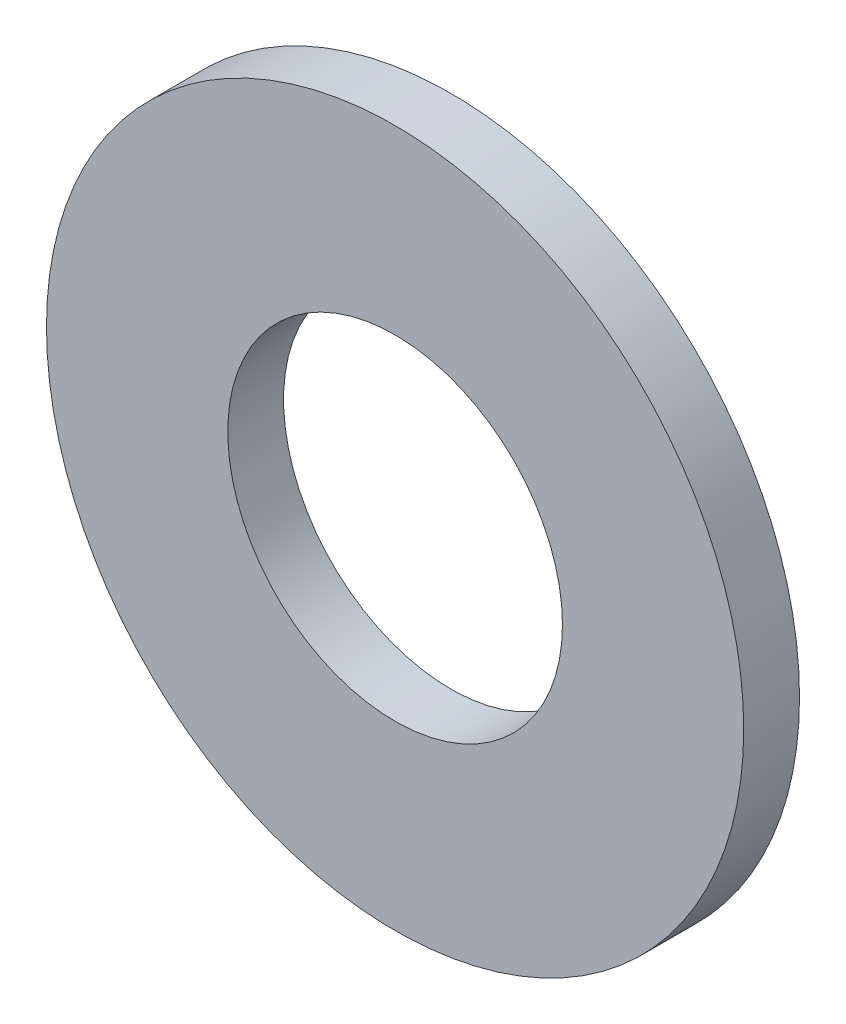
ISO-10303-21;
HEADER;
FILE_DESCRIPTION(('STEP AP214'),'2;1');
FILE_NAME('part.step','',(''),(''),'','','');
FILE_SCHEMA(('AUTOMOTIVE_DESIGN { 1 0 10303 214 1 1 1 1 }'));
ENDSEC;
DATA;
#1=APPLICATION_CONTEXT('core data for automotive mechanical design processes');
#2=APPLICATION_PROTOCOL_DEFINITION('international standard','automotive_design',2000,#1);
#3=PRODUCT_CONTEXT('',#1,'mechanical');
#4=PRODUCT('Part','Part','',(#3));
#5=PRODUCT_RELATED_PRODUCT_CATEGORY('part','',(#4));
#6=PRODUCT_DEFINITION_FORMATION('','',#4);
#7=PRODUCT_DEFINITION_CONTEXT('part definition',#1,'design');
#8=PRODUCT_DEFINITION('design','',#6,#7);
#9=PRODUCT_DEFINITION_SHAPE('','',#8);
#10=(LENGTH_UNIT() NAMED_UNIT(*) SI_UNIT(.MILLI.,.METRE.));
#11=(NAMED_UNIT(*) PLANE_ANGLE_UNIT() SI_UNIT($,.RADIAN.));
#12=(NAMED_UNIT(*) SI_UNIT($,.STERADIAN.) SOLID_ANGLE_UNIT());
#13=UNCERTAINTY_MEASURE_WITH_UNIT(LENGTH_MEASURE(1.E-05),#10,'distance_accuracy_value','');
#14=(GEOMETRIC_REPRESENTATION_CONTEXT(3) GLOBAL_UNCERTAINTY_ASSIGNED_CONTEXT((#13)) GLOBAL_UNIT_ASSIGNED_CONTEXT((#10,
#11,#12)) REPRESENTATION_CONTEXT('',''));
#15=CARTESIAN_POINT('',(0.,0.,0.));
#16=DIRECTION('',(0.,0.,1.));
#17=DIRECTION('',(1.,0.,0.));
#18=AXIS2_PLACEMENT_3D('',#15,#16,#17);
#19=CARTESIAN_POINT('',(0.,0.,2.));
#20=DIRECTION('',(0.,0.,1.));
#21=DIRECTION('',(1.,0.,0.));
#22=AXIS2_PLACEMENT_3D('',#19,#20,#21);
#23=PLANE('',#22);
#24=CARTESIAN_POINT('',(0.,0.,2.));
#25=DIRECTION('',(0.,0.,1.));
#26=DIRECTION('',(1.,0.,0.));
#27=AXIS2_PLACEMENT_3D('',#24,#25,#26);
#28=CIRCLE('',#27,12.5);
#29=CARTESIAN_POINT('',(12.5,0.,2.));
#30=VERTEX_POINT('',#29);
#31=EDGE_CURVE('E10',#30,#30,#28,.T.);
#32=ORIENTED_EDGE('',*,*,#31,.T.);
#33=EDGE_LOOP('',(#32));
#34=FACE_BOUND('',#33,.T.);
#35=CARTESIAN_POINT('',(0.,0.,2.));
#36=DIRECTION('',(0.,0.,1.));
#37=DIRECTION('',(1.,0.,0.));
#38=AXIS2_PLACEMENT_3D('',#35,#36,#37);
#39=CIRCLE('',#38,6.);
#40=CARTESIAN_POINT('',(6.,0.,2.));
#41=VERTEX_POINT('',#40);
#42=EDGE_CURVE('E45',#41,#41,#39,.T.);
#43=ORIENTED_EDGE('',*,*,#42,.F.);
#44=EDGE_LOOP('',(#43));
#45=FACE_BOUND('',#44,.T.);
#46=ADVANCED_FACE('F34',(#34,#45),#23,.T.);
#47=CARTESIAN_POINT('',(0.,0.,0.));
#48=DIRECTION('',(0.,0.,1.));
#49=DIRECTION('',(1.,0.,0.));
#50=AXIS2_PLACEMENT_3D('',#47,#48,#49);
#51=PLANE('',#50);
#52=CARTESIAN_POINT('',(0.,0.,0.));
#53=DIRECTION('',(0.,0.,1.));
#54=DIRECTION('',(1.,0.,0.));
#55=AXIS2_PLACEMENT_3D('',#52,#53,#54);
#56=CIRCLE('',#55,12.5);
#57=CARTESIAN_POINT('',(12.5,0.,0.));
#58=VERTEX_POINT('',#57);
#59=EDGE_CURVE('E38',#58,#58,#56,.T.);
#60=ORIENTED_EDGE('',*,*,#59,.F.);
#61=EDGE_LOOP('',(#60));
#62=FACE_BOUND('',#61,.T.);
#63=CARTESIAN_POINT('',(0.,0.,0.));
#64=DIRECTION('',(0.,0.,1.));
#65=DIRECTION('',(1.,0.,0.));
#66=AXIS2_PLACEMENT_3D('',#63,#64,#65);
#67=CIRCLE('',#66,6.);
#68=CARTESIAN_POINT('',(6.,0.,0.));
#69=VERTEX_POINT('',#68);
#70=EDGE_CURVE('E47',#69,#69,#67,.T.);
#71=ORIENTED_EDGE('',*,*,#70,.T.);
#72=EDGE_LOOP('',(#71));
#73=FACE_BOUND('',#72,.T.);
#74=ADVANCED_FACE('F57',(#62,#73),#51,.F.);
#75=CARTESIAN_POINT('',(0.,0.,2.));
#76=DIRECTION('',(0.,0.,-1.));
#77=DIRECTION('',(-1.,0.,0.));
#78=AXIS2_PLACEMENT_3D('',#75,#76,#77);
#79=CYLINDRICAL_SURFACE('',#78,12.5);
#80=ORIENTED_EDGE('',*,*,#31,.F.);
#81=EDGE_LOOP('',(#80));
#82=FACE_BOUND('',#81,.T.);
#83=ORIENTED_EDGE('',*,*,#59,.T.);
#84=EDGE_LOOP('',(#83));
#85=FACE_BOUND('',#84,.T.);
#86=ADVANCED_FACE('F36',(#82,#85),#79,.T.);
#87=CARTESIAN_POINT('',(0.,0.,2.));
#88=DIRECTION('',(0.,0.,-1.));
#89=DIRECTION('',(-1.,0.,0.));
#90=AXIS2_PLACEMENT_3D('',#87,#88,#89);
#91=CYLINDRICAL_SURFACE('',#90,6.);
#92=ORIENTED_EDGE('',*,*,#42,.T.);
#93=EDGE_LOOP('',(#92));
#94=FACE_BOUND('',#93,.T.);
#95=ORIENTED_EDGE('',*,*,#70,.F.);
#96=EDGE_LOOP('',(#95));
#97=FACE_BOUND('',#96,.T.);
#98=ADVANCED_FACE('F53',(#94,#97),#91,.F.);
#99=CLOSED_SHELL('',(#46,#74,#86,#98));
#100=MANIFOLD_SOLID_BREP('B2',#99);
#101=ADVANCED_BREP_SHAPE_REPRESENTATION('',(#18,#100),#14);
#102=SHAPE_DEFINITION_REPRESENTATION(#9,#101);
ENDSEC;
END-ISO-10303-21;
